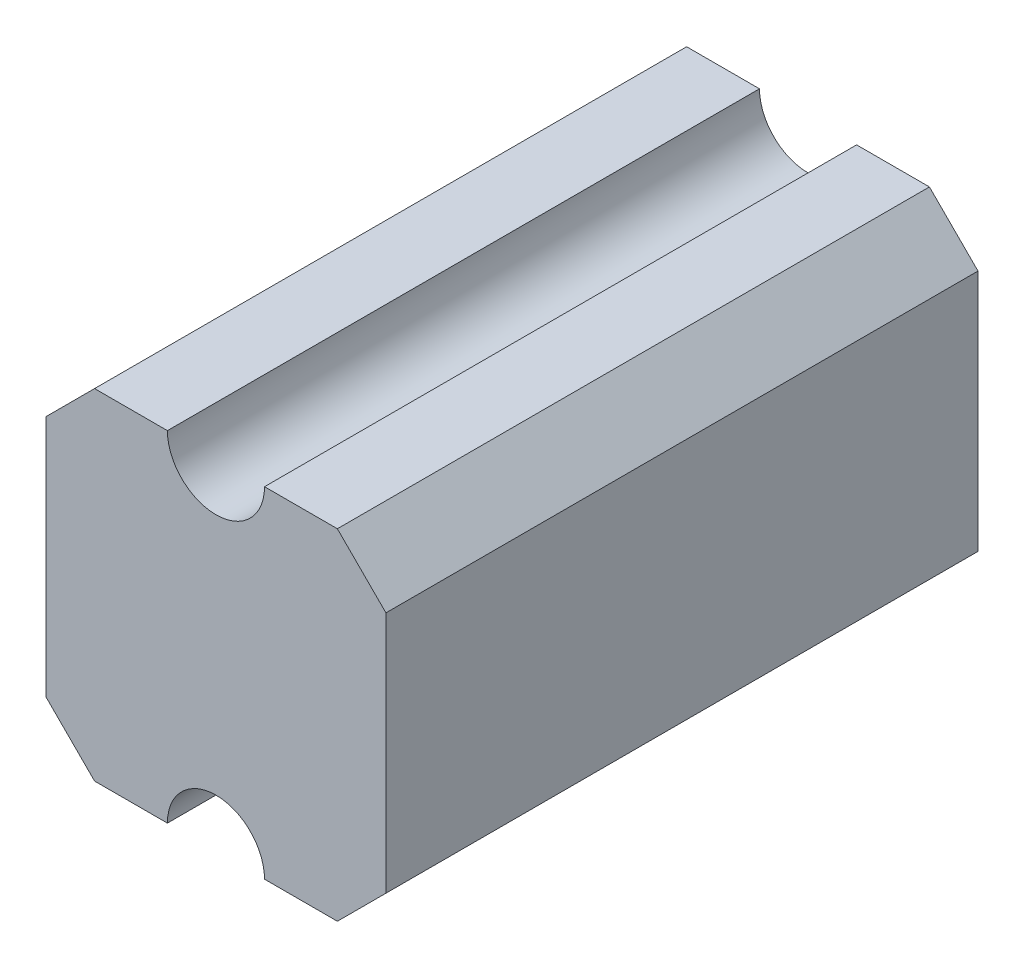
ISO-10303-21;
HEADER;
FILE_DESCRIPTION(('STEP AP214'),'2;1');
FILE_NAME('part.step','',(''),(''),'','','');
FILE_SCHEMA(('AUTOMOTIVE_DESIGN { 1 0 10303 214 1 1 1 1 }'));
ENDSEC;
DATA;
#1=APPLICATION_CONTEXT('core data for automotive mechanical design processes');
#2=APPLICATION_PROTOCOL_DEFINITION('international standard','automotive_design',2000,#1);
#3=PRODUCT_CONTEXT('',#1,'mechanical');
#4=PRODUCT('Part','Part','',(#3));
#5=PRODUCT_RELATED_PRODUCT_CATEGORY('part','',(#4));
#6=PRODUCT_DEFINITION_FORMATION('','',#4);
#7=PRODUCT_DEFINITION_CONTEXT('part definition',#1,'design');
#8=PRODUCT_DEFINITION('design','',#6,#7);
#9=PRODUCT_DEFINITION_SHAPE('','',#8);
#10=(LENGTH_UNIT() NAMED_UNIT(*) SI_UNIT(.MILLI.,.METRE.));
#11=(NAMED_UNIT(*) PLANE_ANGLE_UNIT() SI_UNIT($,.RADIAN.));
#12=(NAMED_UNIT(*) SI_UNIT($,.STERADIAN.) SOLID_ANGLE_UNIT());
#13=UNCERTAINTY_MEASURE_WITH_UNIT(LENGTH_MEASURE(1.E-05),#10,'distance_accuracy_value','');
#14=(GEOMETRIC_REPRESENTATION_CONTEXT(3) GLOBAL_UNCERTAINTY_ASSIGNED_CONTEXT((#13)) GLOBAL_UNIT_ASSIGNED_CONTEXT((#10,
#11,#12)) REPRESENTATION_CONTEXT('',''));
#15=CARTESIAN_POINT('',(0.,0.,0.));
#16=DIRECTION('',(0.,0.,1.));
#17=DIRECTION('',(1.,0.,0.));
#18=AXIS2_PLACEMENT_3D('',#15,#16,#17);
#19=CARTESIAN_POINT('',(50.,118.656673600845,1348.73120338217));
#20=DIRECTION('',(0.,1.,0.));
#21=DIRECTION('',(-1.,0.,0.));
#22=AXIS2_PLACEMENT_3D('',#19,#20,#21);
#23=PLANE('',#22);
#24=DIRECTION('',(1.,0.,0.));
#25=VECTOR('',#24,1.);
#26=CARTESIAN_POINT('',(50.,118.656673600845,739.131203382171));
#27=LINE('',#26,#25);
#28=CARTESIAN_POINT('',(50.,118.656673600845,739.131203382171));
#29=VERTEX_POINT('',#28);
#30=CARTESIAN_POINT('',(125.,118.656673600845,739.131203382171));
#31=VERTEX_POINT('',#30);
#32=EDGE_CURVE('E167',#29,#31,#27,.T.);
#33=ORIENTED_EDGE('',*,*,#32,.T.);
#34=DIRECTION('',(0.,0.,-1.));
#35=VECTOR('',#34,1.);
#36=CARTESIAN_POINT('',(125.,118.656673600845,1348.73120338217));
#37=LINE('',#36,#35);
#38=CARTESIAN_POINT('',(125.,118.656673600845,1348.73120338217));
#39=VERTEX_POINT('',#38);
#40=EDGE_CURVE('E11',#39,#31,#37,.T.);
#41=ORIENTED_EDGE('',*,*,#40,.F.);
#42=DIRECTION('',(1.,0.,0.));
#43=VECTOR('',#42,1.);
#44=CARTESIAN_POINT('',(50.,118.656673600845,1348.73120338217));
#45=LINE('',#44,#43);
#46=CARTESIAN_POINT('',(50.,118.656673600845,1348.73120338217));
#47=VERTEX_POINT('',#46);
#48=EDGE_CURVE('E189',#47,#39,#45,.T.);
#49=ORIENTED_EDGE('',*,*,#48,.F.);
#50=DIRECTION('',(0.,0.,-1.));
#51=VECTOR('',#50,1.);
#52=CARTESIAN_POINT('',(50.,118.656673600845,1348.73120338217));
#53=LINE('',#52,#51);
#54=EDGE_CURVE('E163',#47,#29,#53,.T.);
#55=ORIENTED_EDGE('',*,*,#54,.T.);
#56=EDGE_LOOP('',(#33,#41,#49,#55));
#57=FACE_BOUND('',#56,.T.);
#58=ADVANCED_FACE('F47',(#57),#23,.F.);
#59=CARTESIAN_POINT('',(175.,168.656673600845,1348.73120338217));
#60=DIRECTION('',(-0.707106781186547,0.707106781186547,0.));
#61=DIRECTION('',(-0.707106781186548,-0.707106781186548,0.));
#62=AXIS2_PLACEMENT_3D('',#59,#60,#61);
#63=PLANE('',#62);
#64=DIRECTION('',(0.707106781186547,0.707106781186547,0.));
#65=VECTOR('',#64,1.);
#66=CARTESIAN_POINT('',(175.,168.656673600845,739.131203382171));
#67=LINE('',#66,#65);
#68=CARTESIAN_POINT('',(175.,168.656673600845,739.131203382171));
#69=VERTEX_POINT('',#68);
#70=EDGE_CURVE('E170',#31,#69,#67,.T.);
#71=ORIENTED_EDGE('',*,*,#70,.T.);
#72=DIRECTION('',(0.,0.,-1.));
#73=VECTOR('',#72,1.);
#74=CARTESIAN_POINT('',(175.,168.656673600845,1348.73120338217));
#75=LINE('',#74,#73);
#76=CARTESIAN_POINT('',(175.,168.656673600845,1348.73120338217));
#77=VERTEX_POINT('',#76);
#78=EDGE_CURVE('E55',#77,#69,#75,.T.);
#79=ORIENTED_EDGE('',*,*,#78,.F.);
#80=DIRECTION('',(0.707106781186547,0.707106781186547,0.));
#81=VECTOR('',#80,1.);
#82=CARTESIAN_POINT('',(175.,168.656673600845,1348.73120338217));
#83=LINE('',#82,#81);
#84=EDGE_CURVE('E118',#39,#77,#83,.T.);
#85=ORIENTED_EDGE('',*,*,#84,.F.);
#86=ORIENTED_EDGE('',*,*,#40,.T.);
#87=EDGE_LOOP('',(#71,#79,#85,#86));
#88=FACE_BOUND('',#87,.T.);
#89=ADVANCED_FACE('F267',(#88),#63,.F.);
#90=CARTESIAN_POINT('',(175.,418.656673600845,1348.73120338217));
#91=DIRECTION('',(-1.,0.,0.));
#92=DIRECTION('',(0.,0.,1.));
#93=AXIS2_PLACEMENT_3D('',#90,#91,#92);
#94=PLANE('',#93);
#95=DIRECTION('',(0.,1.,0.));
#96=VECTOR('',#95,1.);
#97=CARTESIAN_POINT('',(175.,418.656673600845,739.131203382171));
#98=LINE('',#97,#96);
#99=CARTESIAN_POINT('',(175.,418.656673600845,739.131203382171));
#100=VERTEX_POINT('',#99);
#101=EDGE_CURVE('E172',#69,#100,#98,.T.);
#102=ORIENTED_EDGE('',*,*,#101,.T.);
#103=DIRECTION('',(0.,0.,-1.));
#104=VECTOR('',#103,1.);
#105=CARTESIAN_POINT('',(175.,418.656673600845,1348.73120338217));
#106=LINE('',#105,#104);
#107=CARTESIAN_POINT('',(175.,418.656673600845,1348.73120338217));
#108=VERTEX_POINT('',#107);
#109=EDGE_CURVE('E208',#108,#100,#106,.T.);
#110=ORIENTED_EDGE('',*,*,#109,.F.);
#111=DIRECTION('',(0.,1.,0.));
#112=VECTOR('',#111,1.);
#113=CARTESIAN_POINT('',(175.,418.656673600845,1348.73120338217));
#114=LINE('',#113,#112);
#115=EDGE_CURVE('E216',#77,#108,#114,.T.);
#116=ORIENTED_EDGE('',*,*,#115,.F.);
#117=ORIENTED_EDGE('',*,*,#78,.T.);
#118=EDGE_LOOP('',(#102,#110,#116,#117));
#119=FACE_BOUND('',#118,.T.);
#120=ADVANCED_FACE('F214',(#119),#94,.F.);
#121=CARTESIAN_POINT('',(125.,468.656673600845,1348.73120338217));
#122=DIRECTION('',(-0.707106781186547,-0.707106781186548,0.));
#123=DIRECTION('',(0.707106781186548,-0.707106781186547,0.));
#124=AXIS2_PLACEMENT_3D('',#121,#122,#123);
#125=PLANE('',#124);
#126=DIRECTION('',(-0.707106781186548,0.707106781186547,0.));
#127=VECTOR('',#126,1.);
#128=CARTESIAN_POINT('',(125.,468.656673600845,739.131203382171));
#129=LINE('',#128,#127);
#130=CARTESIAN_POINT('',(125.,468.656673600845,739.131203382171));
#131=VERTEX_POINT('',#130);
#132=EDGE_CURVE('E174',#100,#131,#129,.T.);
#133=ORIENTED_EDGE('',*,*,#132,.T.);
#134=DIRECTION('',(0.,0.,-1.));
#135=VECTOR('',#134,1.);
#136=CARTESIAN_POINT('',(125.,468.656673600845,1348.73120338217));
#137=LINE('',#136,#135);
#138=CARTESIAN_POINT('',(125.,468.656673600845,1348.73120338217));
#139=VERTEX_POINT('',#138);
#140=EDGE_CURVE('E205',#139,#131,#137,.T.);
#141=ORIENTED_EDGE('',*,*,#140,.F.);
#142=DIRECTION('',(-0.707106781186548,0.707106781186547,0.));
#143=VECTOR('',#142,1.);
#144=CARTESIAN_POINT('',(125.,468.656673600845,1348.73120338217));
#145=LINE('',#144,#143);
#146=EDGE_CURVE('E234',#108,#139,#145,.T.);
#147=ORIENTED_EDGE('',*,*,#146,.F.);
#148=ORIENTED_EDGE('',*,*,#109,.T.);
#149=EDGE_LOOP('',(#133,#141,#147,#148));
#150=FACE_BOUND('',#149,.T.);
#151=ADVANCED_FACE('F225',(#150),#125,.F.);
#152=CARTESIAN_POINT('',(125.,468.656673600845,1348.73120338217));
#153=DIRECTION('',(0.,-1.,0.));
#154=DIRECTION('',(1.,0.,0.));
#155=AXIS2_PLACEMENT_3D('',#152,#153,#154);
#156=PLANE('',#155);
#157=DIRECTION('',(-1.,0.,0.));
#158=VECTOR('',#157,1.);
#159=CARTESIAN_POINT('',(125.,468.656673600845,739.131203382171));
#160=LINE('',#159,#158);
#161=CARTESIAN_POINT('',(49.9999999999999,468.656673600845,739.131203382171));
#162=VERTEX_POINT('',#161);
#163=EDGE_CURVE('E176',#131,#162,#160,.T.);
#164=ORIENTED_EDGE('',*,*,#163,.T.);
#165=DIRECTION('',(0.,0.,-1.));
#166=VECTOR('',#165,1.);
#167=CARTESIAN_POINT('',(49.9999999999999,468.656673600845,1348.73120338217));
#168=LINE('',#167,#166);
#169=CARTESIAN_POINT('',(49.9999999999999,468.656673600845,1348.73120338217));
#170=VERTEX_POINT('',#169);
#171=EDGE_CURVE('E202',#170,#162,#168,.T.);
#172=ORIENTED_EDGE('',*,*,#171,.F.);
#173=DIRECTION('',(-1.,0.,0.));
#174=VECTOR('',#173,1.);
#175=CARTESIAN_POINT('',(125.,468.656673600845,1348.73120338217));
#176=LINE('',#175,#174);
#177=EDGE_CURVE('E231',#139,#170,#176,.T.);
#178=ORIENTED_EDGE('',*,*,#177,.F.);
#179=ORIENTED_EDGE('',*,*,#140,.T.);
#180=EDGE_LOOP('',(#164,#172,#178,#179));
#181=FACE_BOUND('',#180,.T.);
#182=ADVANCED_FACE('F229',(#181),#156,.F.);
#183=CARTESIAN_POINT('',(0.,468.656673600845,1348.73120338217));
#184=DIRECTION('',(0.,0.,-1.));
#185=DIRECTION('',(-1.,0.,0.));
#186=AXIS2_PLACEMENT_3D('',#183,#184,#185);
#187=CYLINDRICAL_SURFACE('',#186,50.);
#188=CARTESIAN_POINT('',(0.,468.656673600845,739.131203382171));
#189=DIRECTION('',(0.,0.,-1.));
#190=DIRECTION('',(1.,0.,0.));
#191=AXIS2_PLACEMENT_3D('',#188,#189,#190);
#192=CIRCLE('',#191,50.);
#193=CARTESIAN_POINT('',(-50.0000000000001,468.656673600845,739.131203382171));
#194=VERTEX_POINT('',#193);
#195=EDGE_CURVE('E178',#162,#194,#192,.T.);
#196=ORIENTED_EDGE('',*,*,#195,.T.);
#197=DIRECTION('',(0.,0.,-1.));
#198=VECTOR('',#197,1.);
#199=CARTESIAN_POINT('',(-50.0000000000001,468.656673600845,1348.73120338217));
#200=LINE('',#199,#198);
#201=CARTESIAN_POINT('',(-50.0000000000001,468.656673600845,1348.73120338217));
#202=VERTEX_POINT('',#201);
#203=EDGE_CURVE('E199',#202,#194,#200,.T.);
#204=ORIENTED_EDGE('',*,*,#203,.F.);
#205=CARTESIAN_POINT('',(0.,468.656673600845,1348.73120338217));
#206=DIRECTION('',(0.,0.,-1.));
#207=DIRECTION('',(1.,0.,0.));
#208=AXIS2_PLACEMENT_3D('',#205,#206,#207);
#209=CIRCLE('',#208,50.);
#210=EDGE_CURVE('E233',#170,#202,#209,.T.);
#211=ORIENTED_EDGE('',*,*,#210,.F.);
#212=ORIENTED_EDGE('',*,*,#171,.T.);
#213=EDGE_LOOP('',(#196,#204,#211,#212));
#214=FACE_BOUND('',#213,.T.);
#215=ADVANCED_FACE('F280',(#214),#187,.F.);
#216=CARTESIAN_POINT('',(-50.0000000000001,468.656673600845,1348.73120338217));
#217=DIRECTION('',(0.,-1.,0.));
#218=DIRECTION('',(1.,0.,0.));
#219=AXIS2_PLACEMENT_3D('',#216,#217,#218);
#220=PLANE('',#219);
#221=DIRECTION('',(-1.,0.,0.));
#222=VECTOR('',#221,1.);
#223=CARTESIAN_POINT('',(-50.0000000000001,468.656673600845,739.131203382171));
#224=LINE('',#223,#222);
#225=CARTESIAN_POINT('',(-125.,468.656673600845,739.131203382171));
#226=VERTEX_POINT('',#225);
#227=EDGE_CURVE('E180',#194,#226,#224,.T.);
#228=ORIENTED_EDGE('',*,*,#227,.T.);
#229=DIRECTION('',(0.,0.,-1.));
#230=VECTOR('',#229,1.);
#231=CARTESIAN_POINT('',(-125.,468.656673600845,1348.73120338217));
#232=LINE('',#231,#230);
#233=CARTESIAN_POINT('',(-125.,468.656673600845,1348.73120338217));
#234=VERTEX_POINT('',#233);
#235=EDGE_CURVE('E196',#234,#226,#232,.T.);
#236=ORIENTED_EDGE('',*,*,#235,.F.);
#237=DIRECTION('',(-1.,0.,0.));
#238=VECTOR('',#237,1.);
#239=CARTESIAN_POINT('',(-50.0000000000001,468.656673600845,1348.73120338217));
#240=LINE('',#239,#238);
#241=EDGE_CURVE('E236',#202,#234,#240,.T.);
#242=ORIENTED_EDGE('',*,*,#241,.F.);
#243=ORIENTED_EDGE('',*,*,#203,.T.);
#244=EDGE_LOOP('',(#228,#236,#242,#243));
#245=FACE_BOUND('',#244,.T.);
#246=ADVANCED_FACE('F283',(#245),#220,.F.);
#247=CARTESIAN_POINT('',(-125.,468.656673600845,1348.73120338217));
#248=DIRECTION('',(0.707106781186548,-0.707106781186547,0.));
#249=DIRECTION('',(0.707106781186547,0.707106781186548,0.));
#250=AXIS2_PLACEMENT_3D('',#247,#248,#249);
#251=PLANE('',#250);
#252=DIRECTION('',(-0.707106781186547,-0.707106781186548,0.));
#253=VECTOR('',#252,1.);
#254=CARTESIAN_POINT('',(-125.,468.656673600845,739.131203382171));
#255=LINE('',#254,#253);
#256=CARTESIAN_POINT('',(-175.,418.656673600845,739.131203382171));
#257=VERTEX_POINT('',#256);
#258=EDGE_CURVE('E182',#226,#257,#255,.T.);
#259=ORIENTED_EDGE('',*,*,#258,.T.);
#260=DIRECTION('',(0.,0.,-1.));
#261=VECTOR('',#260,1.);
#262=CARTESIAN_POINT('',(-175.,418.656673600845,1348.73120338217));
#263=LINE('',#262,#261);
#264=CARTESIAN_POINT('',(-175.,418.656673600845,1348.73120338217));
#265=VERTEX_POINT('',#264);
#266=EDGE_CURVE('E193',#265,#257,#263,.T.);
#267=ORIENTED_EDGE('',*,*,#266,.F.);
#268=DIRECTION('',(-0.707106781186547,-0.707106781186548,0.));
#269=VECTOR('',#268,1.);
#270=CARTESIAN_POINT('',(-125.,468.656673600845,1348.73120338217));
#271=LINE('',#270,#269);
#272=EDGE_CURVE('E242',#234,#265,#271,.T.);
#273=ORIENTED_EDGE('',*,*,#272,.F.);
#274=ORIENTED_EDGE('',*,*,#235,.T.);
#275=EDGE_LOOP('',(#259,#267,#273,#274));
#276=FACE_BOUND('',#275,.T.);
#277=ADVANCED_FACE('F248',(#276),#251,.F.);
#278=CARTESIAN_POINT('',(-175.,418.656673600845,1348.73120338217));
#279=DIRECTION('',(1.,0.,0.));
#280=DIRECTION('',(0.,0.,-1.));
#281=AXIS2_PLACEMENT_3D('',#278,#279,#280);
#282=PLANE('',#281);
#283=DIRECTION('',(0.,-1.,0.));
#284=VECTOR('',#283,1.);
#285=CARTESIAN_POINT('',(-175.,418.656673600845,739.131203382171));
#286=LINE('',#285,#284);
#287=CARTESIAN_POINT('',(-175.,168.656673600845,739.131203382171));
#288=VERTEX_POINT('',#287);
#289=EDGE_CURVE('E184',#257,#288,#286,.T.);
#290=ORIENTED_EDGE('',*,*,#289,.T.);
#291=DIRECTION('',(0.,0.,-1.));
#292=VECTOR('',#291,1.);
#293=CARTESIAN_POINT('',(-175.,168.656673600845,1348.73120338217));
#294=LINE('',#293,#292);
#295=CARTESIAN_POINT('',(-175.,168.656673600845,1348.73120338217));
#296=VERTEX_POINT('',#295);
#297=EDGE_CURVE('E158',#296,#288,#294,.T.);
#298=ORIENTED_EDGE('',*,*,#297,.F.);
#299=DIRECTION('',(0.,-1.,0.));
#300=VECTOR('',#299,1.);
#301=CARTESIAN_POINT('',(-175.,418.656673600845,1348.73120338217));
#302=LINE('',#301,#300);
#303=EDGE_CURVE('E149',#265,#296,#302,.T.);
#304=ORIENTED_EDGE('',*,*,#303,.F.);
#305=ORIENTED_EDGE('',*,*,#266,.T.);
#306=EDGE_LOOP('',(#290,#298,#304,#305));
#307=FACE_BOUND('',#306,.T.);
#308=ADVANCED_FACE('F252',(#307),#282,.F.);
#309=CARTESIAN_POINT('',(-175.,168.656673600845,1348.73120338217));
#310=DIRECTION('',(0.707106781186547,0.707106781186548,0.));
#311=DIRECTION('',(-0.707106781186548,0.707106781186547,0.));
#312=AXIS2_PLACEMENT_3D('',#309,#310,#311);
#313=PLANE('',#312);
#314=DIRECTION('',(0.707106781186548,-0.707106781186547,0.));
#315=VECTOR('',#314,1.);
#316=CARTESIAN_POINT('',(-175.,168.656673600845,739.131203382171));
#317=LINE('',#316,#315);
#318=CARTESIAN_POINT('',(-125.,118.656673600845,739.131203382171));
#319=VERTEX_POINT('',#318);
#320=EDGE_CURVE('E157',#288,#319,#317,.T.);
#321=ORIENTED_EDGE('',*,*,#320,.T.);
#322=DIRECTION('',(0.,0.,-1.));
#323=VECTOR('',#322,1.);
#324=CARTESIAN_POINT('',(-125.,118.656673600845,1348.73120338217));
#325=LINE('',#324,#323);
#326=CARTESIAN_POINT('',(-125.,118.656673600845,1348.73120338217));
#327=VERTEX_POINT('',#326);
#328=EDGE_CURVE('E154',#327,#319,#325,.T.);
#329=ORIENTED_EDGE('',*,*,#328,.F.);
#330=DIRECTION('',(0.707106781186548,-0.707106781186547,0.));
#331=VECTOR('',#330,1.);
#332=CARTESIAN_POINT('',(-175.,168.656673600845,1348.73120338217));
#333=LINE('',#332,#331);
#334=EDGE_CURVE('E143',#296,#327,#333,.T.);
#335=ORIENTED_EDGE('',*,*,#334,.F.);
#336=ORIENTED_EDGE('',*,*,#297,.T.);
#337=EDGE_LOOP('',(#321,#329,#335,#336));
#338=FACE_BOUND('',#337,.T.);
#339=ADVANCED_FACE('F155',(#338),#313,.F.);
#340=CARTESIAN_POINT('',(-125.,118.656673600845,1348.73120338217));
#341=DIRECTION('',(0.,1.,0.));
#342=DIRECTION('',(-1.,0.,0.));
#343=AXIS2_PLACEMENT_3D('',#340,#341,#342);
#344=PLANE('',#343);
#345=DIRECTION('',(1.,0.,0.));
#346=VECTOR('',#345,1.);
#347=CARTESIAN_POINT('',(-125.,118.656673600845,739.131203382171));
#348=LINE('',#347,#346);
#349=CARTESIAN_POINT('',(-50.,118.656673600845,739.131203382171));
#350=VERTEX_POINT('',#349);
#351=EDGE_CURVE('E104',#319,#350,#348,.T.);
#352=ORIENTED_EDGE('',*,*,#351,.T.);
#353=DIRECTION('',(0.,0.,-1.));
#354=VECTOR('',#353,1.);
#355=CARTESIAN_POINT('',(-50.,118.656673600845,1348.73120338217));
#356=LINE('',#355,#354);
#357=CARTESIAN_POINT('',(-50.,118.656673600845,1348.73120338217));
#358=VERTEX_POINT('',#357);
#359=EDGE_CURVE('E159',#358,#350,#356,.T.);
#360=ORIENTED_EDGE('',*,*,#359,.F.);
#361=DIRECTION('',(1.,0.,0.));
#362=VECTOR('',#361,1.);
#363=CARTESIAN_POINT('',(-125.,118.656673600845,1348.73120338217));
#364=LINE('',#363,#362);
#365=EDGE_CURVE('E147',#327,#358,#364,.T.);
#366=ORIENTED_EDGE('',*,*,#365,.F.);
#367=ORIENTED_EDGE('',*,*,#328,.T.);
#368=EDGE_LOOP('',(#352,#360,#366,#367));
#369=FACE_BOUND('',#368,.T.);
#370=ADVANCED_FACE('F161',(#369),#344,.F.);
#371=CARTESIAN_POINT('',(0.,118.656673600845,1348.73120338217));
#372=DIRECTION('',(0.,0.,-1.));
#373=DIRECTION('',(-1.,0.,0.));
#374=AXIS2_PLACEMENT_3D('',#371,#372,#373);
#375=CYLINDRICAL_SURFACE('',#374,50.);
#376=CARTESIAN_POINT('',(0.,118.656673600845,739.131203382171));
#377=DIRECTION('',(0.,0.,-1.));
#378=DIRECTION('',(-1.,0.,0.));
#379=AXIS2_PLACEMENT_3D('',#376,#377,#378);
#380=CIRCLE('',#379,50.);
#381=EDGE_CURVE('E110',#350,#29,#380,.T.);
#382=ORIENTED_EDGE('',*,*,#381,.T.);
#383=ORIENTED_EDGE('',*,*,#54,.F.);
#384=CARTESIAN_POINT('',(0.,118.656673600845,1348.73120338217));
#385=DIRECTION('',(0.,0.,-1.));
#386=DIRECTION('',(-1.,0.,0.));
#387=AXIS2_PLACEMENT_3D('',#384,#385,#386);
#388=CIRCLE('',#387,50.);
#389=EDGE_CURVE('E63',#358,#47,#388,.T.);
#390=ORIENTED_EDGE('',*,*,#389,.F.);
#391=ORIENTED_EDGE('',*,*,#359,.T.);
#392=EDGE_LOOP('',(#382,#383,#390,#391));
#393=FACE_BOUND('',#392,.T.);
#394=ADVANCED_FACE('F256',(#393),#375,.F.);
#395=CARTESIAN_POINT('',(0.,468.656673600845,1348.73120338217));
#396=DIRECTION('',(0.,0.,1.));
#397=DIRECTION('',(1.,0.,0.));
#398=AXIS2_PLACEMENT_3D('',#395,#396,#397);
#399=PLANE('',#398);
#400=ORIENTED_EDGE('',*,*,#48,.T.);
#401=ORIENTED_EDGE('',*,*,#84,.T.);
#402=ORIENTED_EDGE('',*,*,#115,.T.);
#403=ORIENTED_EDGE('',*,*,#146,.T.);
#404=ORIENTED_EDGE('',*,*,#177,.T.);
#405=ORIENTED_EDGE('',*,*,#210,.T.);
#406=ORIENTED_EDGE('',*,*,#241,.T.);
#407=ORIENTED_EDGE('',*,*,#272,.T.);
#408=ORIENTED_EDGE('',*,*,#303,.T.);
#409=ORIENTED_EDGE('',*,*,#334,.T.);
#410=ORIENTED_EDGE('',*,*,#365,.T.);
#411=ORIENTED_EDGE('',*,*,#389,.T.);
#412=EDGE_LOOP('',(#400,#401,#402,#403,#404,#405,#406,#407,#408,#409,#410,#411));
#413=FACE_BOUND('',#412,.T.);
#414=ADVANCED_FACE('F145',(#413),#399,.T.);
#415=CARTESIAN_POINT('',(0.,468.656673600845,739.131203382171));
#416=DIRECTION('',(0.,0.,1.));
#417=DIRECTION('',(1.,0.,0.));
#418=AXIS2_PLACEMENT_3D('',#415,#416,#417);
#419=PLANE('',#418);
#420=ORIENTED_EDGE('',*,*,#32,.F.);
#421=ORIENTED_EDGE('',*,*,#381,.F.);
#422=ORIENTED_EDGE('',*,*,#351,.F.);
#423=ORIENTED_EDGE('',*,*,#320,.F.);
#424=ORIENTED_EDGE('',*,*,#289,.F.);
#425=ORIENTED_EDGE('',*,*,#258,.F.);
#426=ORIENTED_EDGE('',*,*,#227,.F.);
#427=ORIENTED_EDGE('',*,*,#195,.F.);
#428=ORIENTED_EDGE('',*,*,#163,.F.);
#429=ORIENTED_EDGE('',*,*,#132,.F.);
#430=ORIENTED_EDGE('',*,*,#101,.F.);
#431=ORIENTED_EDGE('',*,*,#70,.F.);
#432=EDGE_LOOP('',(#420,#421,#422,#423,#424,#425,#426,#427,#428,#429,#430,#431));
#433=FACE_BOUND('',#432,.T.);
#434=ADVANCED_FACE('F220',(#433),#419,.F.);
#435=CLOSED_SHELL('',(#58,#89,#120,#151,#182,#215,#246,#277,#308,#339,#370,#394,#414,#434));
#436=MANIFOLD_SOLID_BREP('B2',#435);
#437=ADVANCED_BREP_SHAPE_REPRESENTATION('',(#18,#436),#14);
#438=SHAPE_DEFINITION_REPRESENTATION(#9,#437);
ENDSEC;
END-ISO-10303-21;
